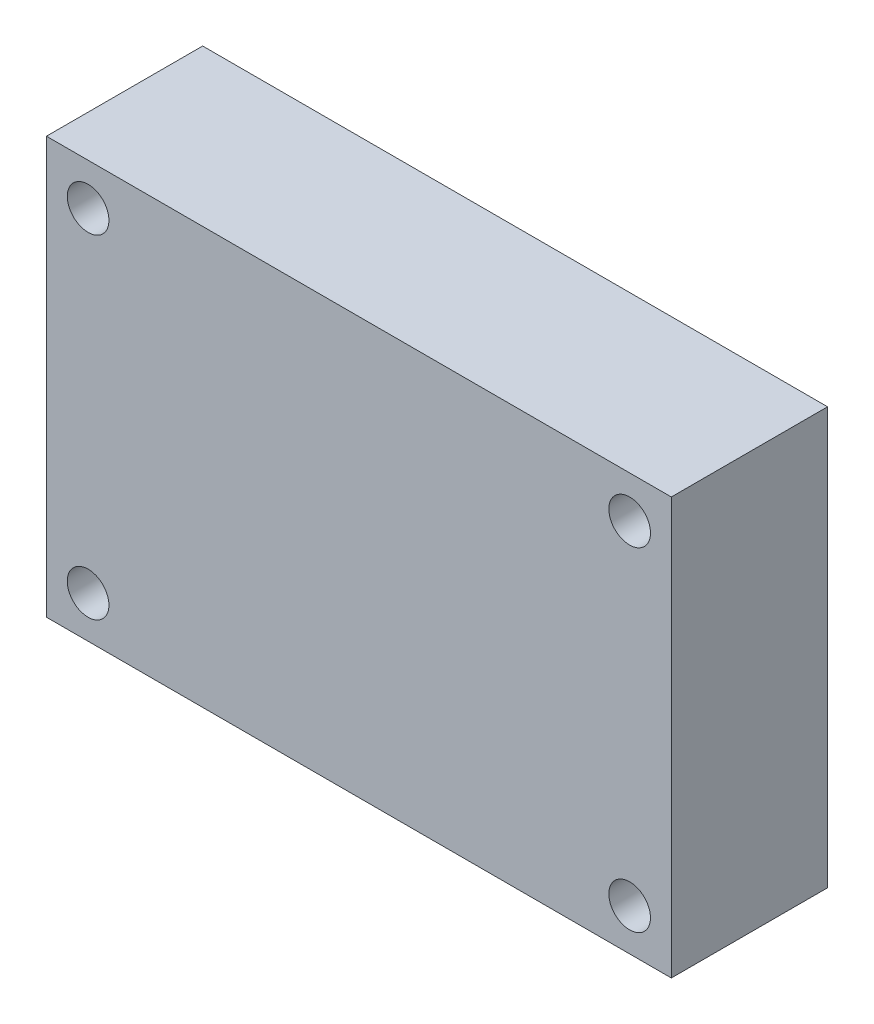
ISO-10303-21;
HEADER;
FILE_DESCRIPTION(('STEP AP214'),'2;1');
FILE_NAME('part.step','',(''),(''),'','','');
FILE_SCHEMA(('AUTOMOTIVE_DESIGN { 1 0 10303 214 1 1 1 1 }'));
ENDSEC;
DATA;
#1=APPLICATION_CONTEXT('core data for automotive mechanical design processes');
#2=APPLICATION_PROTOCOL_DEFINITION('international standard','automotive_design',2000,#1);
#3=PRODUCT_CONTEXT('',#1,'mechanical');
#4=PRODUCT('Part','Part','',(#3));
#5=PRODUCT_RELATED_PRODUCT_CATEGORY('part','',(#4));
#6=PRODUCT_DEFINITION_FORMATION('','',#4);
#7=PRODUCT_DEFINITION_CONTEXT('part definition',#1,'design');
#8=PRODUCT_DEFINITION('design','',#6,#7);
#9=PRODUCT_DEFINITION_SHAPE('','',#8);
#10=(LENGTH_UNIT() NAMED_UNIT(*) SI_UNIT(.MILLI.,.METRE.));
#11=(NAMED_UNIT(*) PLANE_ANGLE_UNIT() SI_UNIT($,.RADIAN.));
#12=(NAMED_UNIT(*) SI_UNIT($,.STERADIAN.) SOLID_ANGLE_UNIT());
#13=UNCERTAINTY_MEASURE_WITH_UNIT(LENGTH_MEASURE(1.E-05),#10,'distance_accuracy_value','');
#14=(GEOMETRIC_REPRESENTATION_CONTEXT(3) GLOBAL_UNCERTAINTY_ASSIGNED_CONTEXT((#13)) GLOBAL_UNIT_ASSIGNED_CONTEXT((#10,
#11,#12)) REPRESENTATION_CONTEXT('',''));
#15=CARTESIAN_POINT('',(0.,0.,0.));
#16=DIRECTION('',(0.,0.,1.));
#17=DIRECTION('',(1.,0.,0.));
#18=AXIS2_PLACEMENT_3D('',#15,#16,#17);
#19=CARTESIAN_POINT('',(30.,-20.,15.));
#20=DIRECTION('',(-1.,0.,0.));
#21=DIRECTION('',(0.,0.,1.));
#22=AXIS2_PLACEMENT_3D('',#19,#20,#21);
#23=PLANE('',#22);
#24=DIRECTION('',(0.,1.,0.));
#25=VECTOR('',#24,1.);
#26=CARTESIAN_POINT('',(30.,-20.,0.));
#27=LINE('',#26,#25);
#28=CARTESIAN_POINT('',(30.,-20.,0.));
#29=VERTEX_POINT('',#28);
#30=CARTESIAN_POINT('',(30.,20.,0.));
#31=VERTEX_POINT('',#30);
#32=EDGE_CURVE('E167',#29,#31,#27,.T.);
#33=ORIENTED_EDGE('',*,*,#32,.T.);
#34=DIRECTION('',(0.,0.,-1.));
#35=VECTOR('',#34,1.);
#36=CARTESIAN_POINT('',(30.,20.,15.));
#37=LINE('',#36,#35);
#38=CARTESIAN_POINT('',(30.,20.,15.));
#39=VERTEX_POINT('',#38);
#40=EDGE_CURVE('E194',#39,#31,#37,.T.);
#41=ORIENTED_EDGE('',*,*,#40,.F.);
#42=DIRECTION('',(0.,1.,0.));
#43=VECTOR('',#42,1.);
#44=CARTESIAN_POINT('',(30.,-20.,15.));
#45=LINE('',#44,#43);
#46=CARTESIAN_POINT('',(30.,-20.,15.));
#47=VERTEX_POINT('',#46);
#48=EDGE_CURVE('E168',#47,#39,#45,.T.);
#49=ORIENTED_EDGE('',*,*,#48,.F.);
#50=DIRECTION('',(0.,0.,-1.));
#51=VECTOR('',#50,1.);
#52=CARTESIAN_POINT('',(30.,-20.,15.));
#53=LINE('',#52,#51);
#54=EDGE_CURVE('E178',#47,#29,#53,.T.);
#55=ORIENTED_EDGE('',*,*,#54,.T.);
#56=EDGE_LOOP('',(#33,#41,#49,#55));
#57=FACE_BOUND('',#56,.T.);
#58=ADVANCED_FACE('F35',(#57),#23,.F.);
#59=CARTESIAN_POINT('',(-30.,20.,15.));
#60=DIRECTION('',(0.,-1.,0.));
#61=DIRECTION('',(0.,0.,-1.));
#62=AXIS2_PLACEMENT_3D('',#59,#60,#61);
#63=PLANE('',#62);
#64=DIRECTION('',(-1.,0.,0.));
#65=VECTOR('',#64,1.);
#66=CARTESIAN_POINT('',(-30.,20.,0.));
#67=LINE('',#66,#65);
#68=CARTESIAN_POINT('',(-30.,20.,0.));
#69=VERTEX_POINT('',#68);
#70=EDGE_CURVE('E181',#31,#69,#67,.T.);
#71=ORIENTED_EDGE('',*,*,#70,.T.);
#72=DIRECTION('',(0.,0.,-1.));
#73=VECTOR('',#72,1.);
#74=CARTESIAN_POINT('',(-30.,20.,15.));
#75=LINE('',#74,#73);
#76=CARTESIAN_POINT('',(-30.,20.,15.));
#77=VERTEX_POINT('',#76);
#78=EDGE_CURVE('E191',#77,#69,#75,.T.);
#79=ORIENTED_EDGE('',*,*,#78,.F.);
#80=DIRECTION('',(-1.,0.,0.));
#81=VECTOR('',#80,1.);
#82=CARTESIAN_POINT('',(-30.,20.,15.));
#83=LINE('',#82,#81);
#84=EDGE_CURVE('E171',#39,#77,#83,.T.);
#85=ORIENTED_EDGE('',*,*,#84,.F.);
#86=ORIENTED_EDGE('',*,*,#40,.T.);
#87=EDGE_LOOP('',(#71,#79,#85,#86));
#88=FACE_BOUND('',#87,.T.);
#89=ADVANCED_FACE('F244',(#88),#63,.F.);
#90=CARTESIAN_POINT('',(-30.,-20.,15.));
#91=DIRECTION('',(1.,0.,0.));
#92=DIRECTION('',(0.,0.,-1.));
#93=AXIS2_PLACEMENT_3D('',#90,#91,#92);
#94=PLANE('',#93);
#95=DIRECTION('',(0.,-1.,0.));
#96=VECTOR('',#95,1.);
#97=CARTESIAN_POINT('',(-30.,-20.,0.));
#98=LINE('',#97,#96);
#99=CARTESIAN_POINT('',(-30.,-20.,0.));
#100=VERTEX_POINT('',#99);
#101=EDGE_CURVE('E183',#69,#100,#98,.T.);
#102=ORIENTED_EDGE('',*,*,#101,.T.);
#103=DIRECTION('',(0.,0.,-1.));
#104=VECTOR('',#103,1.);
#105=CARTESIAN_POINT('',(-30.,-20.,15.));
#106=LINE('',#105,#104);
#107=CARTESIAN_POINT('',(-30.,-20.,15.));
#108=VERTEX_POINT('',#107);
#109=EDGE_CURVE('E188',#108,#100,#106,.T.);
#110=ORIENTED_EDGE('',*,*,#109,.F.);
#111=DIRECTION('',(0.,-1.,0.));
#112=VECTOR('',#111,1.);
#113=CARTESIAN_POINT('',(-30.,-20.,15.));
#114=LINE('',#113,#112);
#115=EDGE_CURVE('E174',#77,#108,#114,.T.);
#116=ORIENTED_EDGE('',*,*,#115,.F.);
#117=ORIENTED_EDGE('',*,*,#78,.T.);
#118=EDGE_LOOP('',(#102,#110,#116,#117));
#119=FACE_BOUND('',#118,.T.);
#120=ADVANCED_FACE('F250',(#119),#94,.F.);
#121=CARTESIAN_POINT('',(-30.,-20.,15.));
#122=DIRECTION('',(0.,1.,0.));
#123=DIRECTION('',(0.,0.,1.));
#124=AXIS2_PLACEMENT_3D('',#121,#122,#123);
#125=PLANE('',#124);
#126=DIRECTION('',(1.,0.,0.));
#127=VECTOR('',#126,1.);
#128=CARTESIAN_POINT('',(-30.,-20.,0.));
#129=LINE('',#128,#127);
#130=EDGE_CURVE('E172',#100,#29,#129,.T.);
#131=ORIENTED_EDGE('',*,*,#130,.T.);
#132=ORIENTED_EDGE('',*,*,#54,.F.);
#133=DIRECTION('',(1.,0.,0.));
#134=VECTOR('',#133,1.);
#135=CARTESIAN_POINT('',(-30.,-20.,15.));
#136=LINE('',#135,#134);
#137=EDGE_CURVE('E176',#108,#47,#136,.T.);
#138=ORIENTED_EDGE('',*,*,#137,.F.);
#139=ORIENTED_EDGE('',*,*,#109,.T.);
#140=EDGE_LOOP('',(#131,#132,#138,#139));
#141=FACE_BOUND('',#140,.T.);
#142=ADVANCED_FACE('F382',(#141),#125,.F.);
#143=CARTESIAN_POINT('',(0.,0.,15.));
#144=DIRECTION('',(0.,0.,-1.));
#145=DIRECTION('',(-1.,0.,0.));
#146=AXIS2_PLACEMENT_3D('',#143,#144,#145);
#147=PLANE('',#146);
#148=CARTESIAN_POINT('',(-26.,16.,15.));
#149=DIRECTION('',(0.,0.,-1.));
#150=DIRECTION('',(-1.,0.,0.));
#151=AXIS2_PLACEMENT_3D('',#148,#149,#150);
#152=CIRCLE('',#151,2.00000000000001);
#153=CARTESIAN_POINT('',(-28.,16.,15.));
#154=VERTEX_POINT('',#153);
#155=EDGE_CURVE('E146',#154,#154,#152,.T.);
#156=ORIENTED_EDGE('',*,*,#155,.T.);
#157=EDGE_LOOP('',(#156));
#158=FACE_BOUND('',#157,.T.);
#159=CARTESIAN_POINT('',(-26.,-16.,15.));
#160=DIRECTION('',(0.,0.,-1.));
#161=DIRECTION('',(-1.,0.,0.));
#162=AXIS2_PLACEMENT_3D('',#159,#160,#161);
#163=CIRCLE('',#162,2.00000000000001);
#164=CARTESIAN_POINT('',(-28.,-16.,15.));
#165=VERTEX_POINT('',#164);
#166=EDGE_CURVE('E152',#165,#165,#163,.T.);
#167=ORIENTED_EDGE('',*,*,#166,.T.);
#168=EDGE_LOOP('',(#167));
#169=FACE_BOUND('',#168,.T.);
#170=CARTESIAN_POINT('',(26.,-16.,15.));
#171=DIRECTION('',(0.,0.,-1.));
#172=DIRECTION('',(-1.,0.,0.));
#173=AXIS2_PLACEMENT_3D('',#170,#171,#172);
#174=CIRCLE('',#173,2.00000000000001);
#175=CARTESIAN_POINT('',(24.,-16.,15.));
#176=VERTEX_POINT('',#175);
#177=EDGE_CURVE('E158',#176,#176,#174,.T.);
#178=ORIENTED_EDGE('',*,*,#177,.T.);
#179=EDGE_LOOP('',(#178));
#180=FACE_BOUND('',#179,.T.);
#181=CARTESIAN_POINT('',(26.,16.,15.));
#182=DIRECTION('',(0.,0.,-1.));
#183=DIRECTION('',(-1.,0.,0.));
#184=AXIS2_PLACEMENT_3D('',#181,#182,#183);
#185=CIRCLE('',#184,2.00000000000001);
#186=CARTESIAN_POINT('',(24.,16.,15.));
#187=VERTEX_POINT('',#186);
#188=EDGE_CURVE('E164',#187,#187,#185,.T.);
#189=ORIENTED_EDGE('',*,*,#188,.T.);
#190=EDGE_LOOP('',(#189));
#191=FACE_BOUND('',#190,.T.);
#192=ORIENTED_EDGE('',*,*,#48,.T.);
#193=ORIENTED_EDGE('',*,*,#84,.T.);
#194=ORIENTED_EDGE('',*,*,#115,.T.);
#195=ORIENTED_EDGE('',*,*,#137,.T.);
#196=EDGE_LOOP('',(#192,#193,#194,#195));
#197=FACE_BOUND('',#196,.T.);
#198=ADVANCED_FACE('F379',(#158,#169,#180,#191,#197),#147,.F.);
#199=CARTESIAN_POINT('',(0.,0.,0.));
#200=DIRECTION('',(0.,0.,-1.));
#201=DIRECTION('',(-1.,0.,0.));
#202=AXIS2_PLACEMENT_3D('',#199,#200,#201);
#203=PLANE('',#202);
#204=CARTESIAN_POINT('',(-13.5649309294363,2.16100400219579,0.));
#205=DIRECTION('',(0.,0.,-1.));
#206=DIRECTION('',(-1.,0.,0.));
#207=AXIS2_PLACEMENT_3D('',#204,#205,#206);
#208=CIRCLE('',#207,8.);
#209=CARTESIAN_POINT('',(-8.7966609667031,-4.262671080068,0.));
#210=VERTEX_POINT('',#209);
#211=CARTESIAN_POINT('',(-18.3332008921694,8.58467908445959,0.));
#212=VERTEX_POINT('',#211);
#213=EDGE_CURVE('E129',#210,#212,#208,.T.);
#214=ORIENTED_EDGE('',*,*,#213,.F.);
#215=CARTESIAN_POINT('',(-2.14750244110978,-13.2202247153897,0.));
#216=DIRECTION('',(0.,0.,1.));
#217=DIRECTION('',(-1.,0.,0.));
#218=AXIS2_PLACEMENT_3D('',#215,#216,#217);
#219=CIRCLE('',#218,11.1556746200369);
#220=CARTESIAN_POINT('',(8.01108902638464,-8.61022518993586,0.));
#221=VERTEX_POINT('',#220);
#222=EDGE_CURVE('E134',#221,#210,#219,.T.);
#223=ORIENTED_EDGE('',*,*,#222,.F.);
#224=CARTESIAN_POINT('',(15.2960569470147,-5.30428471929952,0.));
#225=DIRECTION('',(0.,0.,-1.));
#226=DIRECTION('',(-1.,0.,0.));
#227=AXIS2_PLACEMENT_3D('',#224,#225,#226);
#228=CIRCLE('',#227,8.);
#229=CARTESIAN_POINT('',(22.5810248676447,-1.99834424866318,0.));
#230=VERTEX_POINT('',#229);
#231=EDGE_CURVE('E115',#230,#221,#228,.T.);
#232=ORIENTED_EDGE('',*,*,#231,.F.);
#233=CARTESIAN_POINT('',(-2.14750244110978,-13.2202247153897,0.));
#234=DIRECTION('',(0.,0.,-1.));
#235=DIRECTION('',(-1.,0.,0.));
#236=AXIS2_PLACEMENT_3D('',#233,#234,#235);
#237=CIRCLE('',#236,27.1556746200369);
#238=EDGE_CURVE('E123',#212,#230,#237,.T.);
#239=ORIENTED_EDGE('',*,*,#238,.F.);
#240=EDGE_LOOP('',(#214,#223,#232,#239));
#241=FACE_BOUND('',#240,.T.);
#242=CARTESIAN_POINT('',(-26.,16.,0.));
#243=DIRECTION('',(0.,0.,-1.));
#244=DIRECTION('',(-1.,0.,0.));
#245=AXIS2_PLACEMENT_3D('',#242,#243,#244);
#246=CIRCLE('',#245,2.00000000000001);
#247=CARTESIAN_POINT('',(-28.,16.,0.));
#248=VERTEX_POINT('',#247);
#249=EDGE_CURVE('E141',#248,#248,#246,.T.);
#250=ORIENTED_EDGE('',*,*,#249,.F.);
#251=EDGE_LOOP('',(#250));
#252=FACE_BOUND('',#251,.T.);
#253=CARTESIAN_POINT('',(-26.,-16.,0.));
#254=DIRECTION('',(0.,0.,-1.));
#255=DIRECTION('',(-1.,0.,0.));
#256=AXIS2_PLACEMENT_3D('',#253,#254,#255);
#257=CIRCLE('',#256,2.00000000000001);
#258=CARTESIAN_POINT('',(-28.,-16.,0.));
#259=VERTEX_POINT('',#258);
#260=EDGE_CURVE('E149',#259,#259,#257,.T.);
#261=ORIENTED_EDGE('',*,*,#260,.F.);
#262=EDGE_LOOP('',(#261));
#263=FACE_BOUND('',#262,.T.);
#264=CARTESIAN_POINT('',(26.,-16.,0.));
#265=DIRECTION('',(0.,0.,-1.));
#266=DIRECTION('',(-1.,0.,0.));
#267=AXIS2_PLACEMENT_3D('',#264,#265,#266);
#268=CIRCLE('',#267,2.00000000000001);
#269=CARTESIAN_POINT('',(24.,-16.,0.));
#270=VERTEX_POINT('',#269);
#271=EDGE_CURVE('E155',#270,#270,#268,.T.);
#272=ORIENTED_EDGE('',*,*,#271,.F.);
#273=EDGE_LOOP('',(#272));
#274=FACE_BOUND('',#273,.T.);
#275=CARTESIAN_POINT('',(26.,16.,0.));
#276=DIRECTION('',(0.,0.,-1.));
#277=DIRECTION('',(-1.,0.,0.));
#278=AXIS2_PLACEMENT_3D('',#275,#276,#277);
#279=CIRCLE('',#278,2.00000000000001);
#280=CARTESIAN_POINT('',(24.,16.,0.));
#281=VERTEX_POINT('',#280);
#282=EDGE_CURVE('E161',#281,#281,#279,.T.);
#283=ORIENTED_EDGE('',*,*,#282,.F.);
#284=EDGE_LOOP('',(#283));
#285=FACE_BOUND('',#284,.T.);
#286=ORIENTED_EDGE('',*,*,#32,.F.);
#287=ORIENTED_EDGE('',*,*,#130,.F.);
#288=ORIENTED_EDGE('',*,*,#101,.F.);
#289=ORIENTED_EDGE('',*,*,#70,.F.);
#290=EDGE_LOOP('',(#286,#287,#288,#289));
#291=FACE_BOUND('',#290,.T.);
#292=ADVANCED_FACE('F131',(#241,#252,#263,#274,#285,#291),#203,.T.);
#293=CARTESIAN_POINT('',(26.,16.,25.));
#294=DIRECTION('',(0.,0.,-1.));
#295=DIRECTION('',(-1.,0.,0.));
#296=AXIS2_PLACEMENT_3D('',#293,#294,#295);
#297=CYLINDRICAL_SURFACE('',#296,2.00000000000001);
#298=ORIENTED_EDGE('',*,*,#282,.T.);
#299=EDGE_LOOP('',(#298));
#300=FACE_BOUND('',#299,.T.);
#301=ORIENTED_EDGE('',*,*,#188,.F.);
#302=EDGE_LOOP('',(#301));
#303=FACE_BOUND('',#302,.T.);
#304=ADVANCED_FACE('F273',(#300,#303),#297,.F.);
#305=CARTESIAN_POINT('',(26.,-16.,25.));
#306=DIRECTION('',(0.,0.,-1.));
#307=DIRECTION('',(-1.,0.,0.));
#308=AXIS2_PLACEMENT_3D('',#305,#306,#307);
#309=CYLINDRICAL_SURFACE('',#308,2.00000000000001);
#310=ORIENTED_EDGE('',*,*,#271,.T.);
#311=EDGE_LOOP('',(#310));
#312=FACE_BOUND('',#311,.T.);
#313=ORIENTED_EDGE('',*,*,#177,.F.);
#314=EDGE_LOOP('',(#313));
#315=FACE_BOUND('',#314,.T.);
#316=ADVANCED_FACE('F278',(#312,#315),#309,.F.);
#317=CARTESIAN_POINT('',(-26.,-16.,25.));
#318=DIRECTION('',(0.,0.,-1.));
#319=DIRECTION('',(-1.,0.,0.));
#320=AXIS2_PLACEMENT_3D('',#317,#318,#319);
#321=CYLINDRICAL_SURFACE('',#320,2.00000000000001);
#322=ORIENTED_EDGE('',*,*,#260,.T.);
#323=EDGE_LOOP('',(#322));
#324=FACE_BOUND('',#323,.T.);
#325=ORIENTED_EDGE('',*,*,#166,.F.);
#326=EDGE_LOOP('',(#325));
#327=FACE_BOUND('',#326,.T.);
#328=ADVANCED_FACE('F290',(#324,#327),#321,.F.);
#329=CARTESIAN_POINT('',(-26.,16.,25.));
#330=DIRECTION('',(0.,0.,-1.));
#331=DIRECTION('',(-1.,0.,0.));
#332=AXIS2_PLACEMENT_3D('',#329,#330,#331);
#333=CYLINDRICAL_SURFACE('',#332,2.00000000000001);
#334=ORIENTED_EDGE('',*,*,#249,.T.);
#335=EDGE_LOOP('',(#334));
#336=FACE_BOUND('',#335,.T.);
#337=ORIENTED_EDGE('',*,*,#155,.F.);
#338=EDGE_LOOP('',(#337));
#339=FACE_BOUND('',#338,.T.);
#340=ADVANCED_FACE('F298',(#336,#339),#333,.F.);
#341=CARTESIAN_POINT('',(-13.5649309294363,2.16100400219579,10.));
#342=DIRECTION('',(0.,0.,-1.));
#343=DIRECTION('',(-1.,0.,0.));
#344=AXIS2_PLACEMENT_3D('',#341,#342,#343);
#345=CYLINDRICAL_SURFACE('',#344,8.);
#346=DIRECTION('',(0.,0.,-1.));
#347=VECTOR('',#346,1.);
#348=CARTESIAN_POINT('',(-18.3332008921694,8.58467908445959,10.));
#349=LINE('',#348,#347);
#350=CARTESIAN_POINT('',(-18.3332008921694,8.58467908445959,9.));
#351=VERTEX_POINT('',#350);
#352=EDGE_CURVE('E120',#351,#212,#349,.T.);
#353=ORIENTED_EDGE('',*,*,#352,.F.);
#354=CARTESIAN_POINT('',(-13.5649309294363,2.16100400219579,9.));
#355=DIRECTION('',(0.,0.,-1.));
#356=DIRECTION('',(-1.,0.,0.));
#357=AXIS2_PLACEMENT_3D('',#354,#355,#356);
#358=CIRCLE('',#357,8.);
#359=CARTESIAN_POINT('',(-8.7966609667031,-4.262671080068,9.));
#360=VERTEX_POINT('',#359);
#361=EDGE_CURVE('E206',#351,#360,#358,.F.);
#362=ORIENTED_EDGE('',*,*,#361,.T.);
#363=DIRECTION('',(0.,0.,-1.));
#364=VECTOR('',#363,1.);
#365=CARTESIAN_POINT('',(-8.7966609667031,-4.262671080068,10.));
#366=LINE('',#365,#364);
#367=EDGE_CURVE('E139',#360,#210,#366,.T.);
#368=ORIENTED_EDGE('',*,*,#367,.T.);
#369=ORIENTED_EDGE('',*,*,#213,.T.);
#370=EDGE_LOOP('',(#353,#362,#368,#369));
#371=FACE_BOUND('',#370,.T.);
#372=ADVANCED_FACE('F224',(#371),#345,.F.);
#373=CARTESIAN_POINT('',(-2.14750244110978,-13.2202247153897,10.));
#374=DIRECTION('',(0.,0.,-1.));
#375=DIRECTION('',(-1.,0.,0.));
#376=AXIS2_PLACEMENT_3D('',#373,#374,#375);
#377=CYLINDRICAL_SURFACE('',#376,11.1556746200369);
#378=ORIENTED_EDGE('',*,*,#367,.F.);
#379=CARTESIAN_POINT('',(-2.14750244110978,-13.2202247153897,9.));
#380=DIRECTION('',(0.,0.,-1.));
#381=DIRECTION('',(-1.,0.,0.));
#382=AXIS2_PLACEMENT_3D('',#379,#380,#381);
#383=CIRCLE('',#382,11.1556746200369);
#384=CARTESIAN_POINT('',(8.01108902638464,-8.61022518993586,9.));
#385=VERTEX_POINT('',#384);
#386=EDGE_CURVE('E59',#360,#385,#383,.T.);
#387=ORIENTED_EDGE('',*,*,#386,.T.);
#388=DIRECTION('',(0.,0.,-1.));
#389=VECTOR('',#388,1.);
#390=CARTESIAN_POINT('',(8.01108902638464,-8.61022518993586,10.));
#391=LINE('',#390,#389);
#392=EDGE_CURVE('E119',#385,#221,#391,.T.);
#393=ORIENTED_EDGE('',*,*,#392,.T.);
#394=ORIENTED_EDGE('',*,*,#222,.T.);
#395=EDGE_LOOP('',(#378,#387,#393,#394));
#396=FACE_BOUND('',#395,.T.);
#397=ADVANCED_FACE('F226',(#396),#377,.T.);
#398=CARTESIAN_POINT('',(15.2960569470147,-5.30428471929952,10.));
#399=DIRECTION('',(0.,0.,-1.));
#400=DIRECTION('',(-1.,0.,0.));
#401=AXIS2_PLACEMENT_3D('',#398,#399,#400);
#402=CYLINDRICAL_SURFACE('',#401,8.);
#403=ORIENTED_EDGE('',*,*,#392,.F.);
#404=CARTESIAN_POINT('',(15.2960569470147,-5.30428471929952,9.));
#405=DIRECTION('',(0.,0.,-1.));
#406=DIRECTION('',(-1.,0.,0.));
#407=AXIS2_PLACEMENT_3D('',#404,#405,#406);
#408=CIRCLE('',#407,8.);
#409=CARTESIAN_POINT('',(22.5810248676447,-1.99834424866318,9.));
#410=VERTEX_POINT('',#409);
#411=EDGE_CURVE('E44',#385,#410,#408,.F.);
#412=ORIENTED_EDGE('',*,*,#411,.T.);
#413=DIRECTION('',(0.,0.,-1.));
#414=VECTOR('',#413,1.);
#415=CARTESIAN_POINT('',(22.5810248676447,-1.99834424866318,10.));
#416=LINE('',#415,#414);
#417=EDGE_CURVE('E111',#410,#230,#416,.T.);
#418=ORIENTED_EDGE('',*,*,#417,.T.);
#419=ORIENTED_EDGE('',*,*,#231,.T.);
#420=EDGE_LOOP('',(#403,#412,#418,#419));
#421=FACE_BOUND('',#420,.T.);
#422=ADVANCED_FACE('F113',(#421),#402,.F.);
#423=CARTESIAN_POINT('',(-2.14750244110978,-13.2202247153897,10.));
#424=DIRECTION('',(0.,0.,-1.));
#425=DIRECTION('',(-1.,0.,0.));
#426=AXIS2_PLACEMENT_3D('',#423,#424,#425);
#427=CYLINDRICAL_SURFACE('',#426,27.1556746200369);
#428=ORIENTED_EDGE('',*,*,#417,.F.);
#429=CARTESIAN_POINT('',(-2.14750244110978,-13.2202247153897,9.));
#430=DIRECTION('',(0.,0.,-1.));
#431=DIRECTION('',(-1.,0.,0.));
#432=AXIS2_PLACEMENT_3D('',#429,#430,#431);
#433=CIRCLE('',#432,27.1556746200369);
#434=EDGE_CURVE('E11',#410,#351,#433,.F.);
#435=ORIENTED_EDGE('',*,*,#434,.T.);
#436=ORIENTED_EDGE('',*,*,#352,.T.);
#437=ORIENTED_EDGE('',*,*,#238,.T.);
#438=EDGE_LOOP('',(#428,#435,#436,#437));
#439=FACE_BOUND('',#438,.T.);
#440=ADVANCED_FACE('F124',(#439),#427,.F.);
#441=CARTESIAN_POINT('',(-7.85621668527302,-5.52961035659694,10.));
#442=DIRECTION('',(0.,0.,-1.));
#443=DIRECTION('',(-1.,0.,0.));
#444=AXIS2_PLACEMENT_3D('',#441,#442,#443);
#445=PLANE('',#444);
#446=CARTESIAN_POINT('',(-2.14750244110978,-13.2202247153897,10.));
#447=DIRECTION('',(0.,0.,-1.));
#448=DIRECTION('',(-1.,0.,0.));
#449=AXIS2_PLACEMENT_3D('',#446,#447,#448);
#450=CIRCLE('',#449,12.1556746200369);
#451=CARTESIAN_POINT('',(8.9217100164634,-8.19698263110632,10.));
#452=VERTEX_POINT('',#451);
#453=CARTESIAN_POINT('',(-9.39269471204474,-3.45971169478502,10.));
#454=VERTEX_POINT('',#453);
#455=EDGE_CURVE('E201',#452,#454,#450,.F.);
#456=ORIENTED_EDGE('',*,*,#455,.T.);
#457=CARTESIAN_POINT('',(-13.5649309294363,2.16100400219579,10.));
#458=DIRECTION('',(0.,0.,-1.));
#459=DIRECTION('',(-1.,0.,0.));
#460=AXIS2_PLACEMENT_3D('',#457,#458,#459);
#461=CIRCLE('',#460,7.);
#462=CARTESIAN_POINT('',(-17.7371671468278,7.78171969917661,10.));
#463=VERTEX_POINT('',#462);
#464=EDGE_CURVE('E203',#454,#463,#461,.T.);
#465=ORIENTED_EDGE('',*,*,#464,.T.);
#466=CARTESIAN_POINT('',(-2.14750244110978,-13.2202247153897,10.));
#467=DIRECTION('',(0.,0.,-1.));
#468=DIRECTION('',(-1.,0.,0.));
#469=AXIS2_PLACEMENT_3D('',#466,#467,#468);
#470=CIRCLE('',#469,26.1556746200369);
#471=CARTESIAN_POINT('',(21.670403877566,-2.41158680749272,10.));
#472=VERTEX_POINT('',#471);
#473=EDGE_CURVE('E197',#463,#472,#470,.T.);
#474=ORIENTED_EDGE('',*,*,#473,.T.);
#475=CARTESIAN_POINT('',(15.2960569470147,-5.30428471929952,10.));
#476=DIRECTION('',(0.,0.,-1.));
#477=DIRECTION('',(-1.,0.,0.));
#478=AXIS2_PLACEMENT_3D('',#475,#476,#477);
#479=CIRCLE('',#478,7.);
#480=EDGE_CURVE('E199',#472,#452,#479,.T.);
#481=ORIENTED_EDGE('',*,*,#480,.T.);
#482=EDGE_LOOP('',(#456,#465,#474,#481));
#483=FACE_BOUND('',#482,.T.);
#484=ADVANCED_FACE('F242',(#483),#445,.T.);
#485=CARTESIAN_POINT('',(15.2960569470147,-5.30428471929952,9.));
#486=DIRECTION('',(0.,0.,-1.));
#487=DIRECTION('',(-1.,0.,0.));
#488=AXIS2_PLACEMENT_3D('',#485,#486,#487);
#489=TOROIDAL_SURFACE('',#488,7.,1.);
#490=CARTESIAN_POINT('',(21.670403877566,-2.41158680749272,9.));
#491=DIRECTION('',(0.413242558829542,-0.910620990078755,0.));
#492=DIRECTION('',(0.910620990078756,0.413242558829542,0.));
#493=AXIS2_PLACEMENT_3D('',#490,#491,#492);
#494=CIRCLE('',#493,1.);
#495=EDGE_CURVE('E214',#410,#472,#494,.T.);
#496=ORIENTED_EDGE('',*,*,#495,.F.);
#497=ORIENTED_EDGE('',*,*,#411,.F.);
#498=CARTESIAN_POINT('',(8.9217100164634,-8.19698263110632,9.));
#499=DIRECTION('',(0.41324255882954,-0.910620990078756,0.));
#500=DIRECTION('',(0.910620990078756,0.41324255882954,0.));
#501=AXIS2_PLACEMENT_3D('',#498,#499,#500);
#502=CIRCLE('',#501,1.);
#503=EDGE_CURVE('E39',#452,#385,#502,.T.);
#504=ORIENTED_EDGE('',*,*,#503,.F.);
#505=ORIENTED_EDGE('',*,*,#480,.F.);
#506=EDGE_LOOP('',(#496,#497,#504,#505));
#507=FACE_BOUND('',#506,.T.);
#508=ADVANCED_FACE('F37',(#507),#489,.F.);
#509=CARTESIAN_POINT('',(-2.14750244110978,-13.2202247153897,9.));
#510=DIRECTION('',(0.,0.,-1.));
#511=DIRECTION('',(-1.,0.,0.));
#512=AXIS2_PLACEMENT_3D('',#509,#510,#511);
#513=TOROIDAL_SURFACE('',#512,12.1556746200369,1.);
#514=ORIENTED_EDGE('',*,*,#503,.T.);
#515=ORIENTED_EDGE('',*,*,#386,.F.);
#516=CARTESIAN_POINT('',(-9.39269471204474,-3.45971169478502,9.));
#517=DIRECTION('',(0.802959385282974,0.596033745341645,0.));
#518=DIRECTION('',(-0.596033745341645,0.802959385282974,0.));
#519=AXIS2_PLACEMENT_3D('',#516,#517,#518);
#520=CIRCLE('',#519,1.);
#521=EDGE_CURVE('E213',#454,#360,#520,.T.);
#522=ORIENTED_EDGE('',*,*,#521,.F.);
#523=ORIENTED_EDGE('',*,*,#455,.F.);
#524=EDGE_LOOP('',(#514,#515,#522,#523));
#525=FACE_BOUND('',#524,.T.);
#526=ADVANCED_FACE('F235',(#525),#513,.F.);
#527=CARTESIAN_POINT('',(-2.14750244110978,-13.2202247153897,9.));
#528=DIRECTION('',(0.,0.,-1.));
#529=DIRECTION('',(-1.,0.,0.));
#530=AXIS2_PLACEMENT_3D('',#527,#528,#529);
#531=TOROIDAL_SURFACE('',#530,26.1556746200369,1.);
#532=ORIENTED_EDGE('',*,*,#495,.T.);
#533=ORIENTED_EDGE('',*,*,#473,.F.);
#534=CARTESIAN_POINT('',(-17.7371671468278,7.78171969917661,9.));
#535=DIRECTION('',(0.802959385282974,0.596033745341645,0.));
#536=DIRECTION('',(-0.596033745341645,0.802959385282974,0.));
#537=AXIS2_PLACEMENT_3D('',#534,#535,#536);
#538=CIRCLE('',#537,1.);
#539=EDGE_CURVE('E211',#351,#463,#538,.T.);
#540=ORIENTED_EDGE('',*,*,#539,.F.);
#541=ORIENTED_EDGE('',*,*,#434,.F.);
#542=EDGE_LOOP('',(#532,#533,#540,#541));
#543=FACE_BOUND('',#542,.T.);
#544=ADVANCED_FACE('F230',(#543),#531,.F.);
#545=CARTESIAN_POINT('',(-13.5649309294363,2.16100400219579,9.));
#546=DIRECTION('',(0.,0.,-1.));
#547=DIRECTION('',(-1.,0.,0.));
#548=AXIS2_PLACEMENT_3D('',#545,#546,#547);
#549=TOROIDAL_SURFACE('',#548,7.,1.);
#550=ORIENTED_EDGE('',*,*,#521,.T.);
#551=ORIENTED_EDGE('',*,*,#361,.F.);
#552=ORIENTED_EDGE('',*,*,#539,.T.);
#553=ORIENTED_EDGE('',*,*,#464,.F.);
#554=EDGE_LOOP('',(#550,#551,#552,#553));
#555=FACE_BOUND('',#554,.T.);
#556=ADVANCED_FACE('F233',(#555),#549,.F.);
#557=CLOSED_SHELL('',(#58,#89,#120,#142,#198,#292,#304,#316,#328,#340,#372,#397,#422,#440,#484,
#508,#526,#544,#556));
#558=MANIFOLD_SOLID_BREP('B2',#557);
#559=ADVANCED_BREP_SHAPE_REPRESENTATION('',(#18,#558),#14);
#560=SHAPE_DEFINITION_REPRESENTATION(#9,#559);
ENDSEC;
END-ISO-10303-21;
